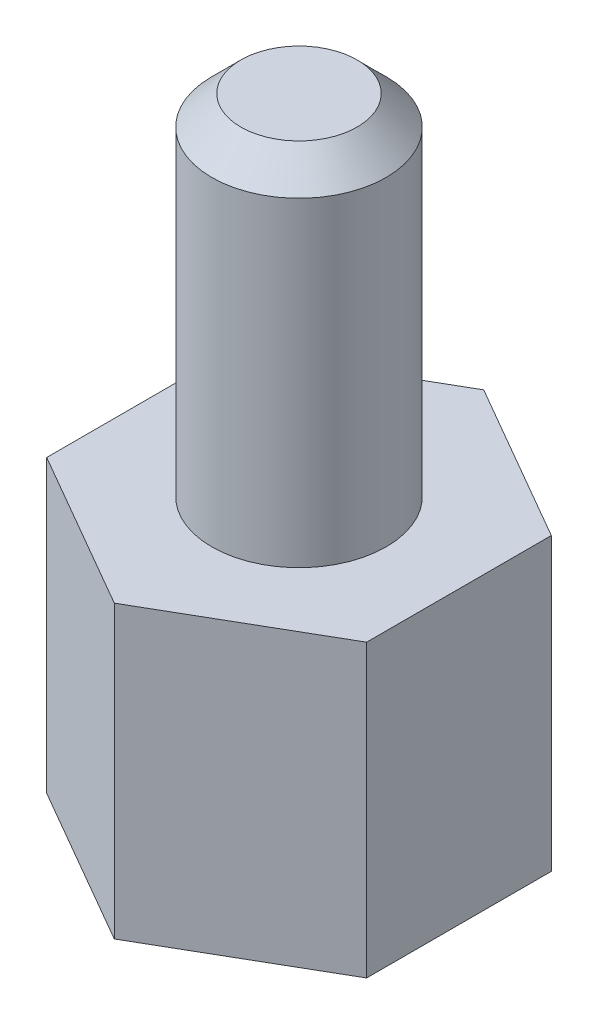
ISO-10303-21;
HEADER;
FILE_DESCRIPTION(('STEP AP214'),'2;1');
FILE_NAME('part.step','',(''),(''),'','','');
FILE_SCHEMA(('AUTOMOTIVE_DESIGN { 1 0 10303 214 1 1 1 1 }'));
ENDSEC;
DATA;
#1=APPLICATION_CONTEXT('core data for automotive mechanical design processes');
#2=APPLICATION_PROTOCOL_DEFINITION('international standard','automotive_design',2000,#1);
#3=PRODUCT_CONTEXT('',#1,'mechanical');
#4=PRODUCT('Part','Part','',(#3));
#5=PRODUCT_RELATED_PRODUCT_CATEGORY('part','',(#4));
#6=PRODUCT_DEFINITION_FORMATION('','',#4);
#7=PRODUCT_DEFINITION_CONTEXT('part definition',#1,'design');
#8=PRODUCT_DEFINITION('design','',#6,#7);
#9=PRODUCT_DEFINITION_SHAPE('','',#8);
#10=(LENGTH_UNIT() NAMED_UNIT(*) SI_UNIT(.MILLI.,.METRE.));
#11=(NAMED_UNIT(*) PLANE_ANGLE_UNIT() SI_UNIT($,.RADIAN.));
#12=(NAMED_UNIT(*) SI_UNIT($,.STERADIAN.) SOLID_ANGLE_UNIT());
#13=UNCERTAINTY_MEASURE_WITH_UNIT(LENGTH_MEASURE(1.E-05),#10,'distance_accuracy_value','');
#14=(GEOMETRIC_REPRESENTATION_CONTEXT(3) GLOBAL_UNCERTAINTY_ASSIGNED_CONTEXT((#13)) GLOBAL_UNIT_ASSIGNED_CONTEXT((#10,
#11,#12)) REPRESENTATION_CONTEXT('',''));
#15=CARTESIAN_POINT('',(0.,0.,0.));
#16=DIRECTION('',(0.,0.,1.));
#17=DIRECTION('',(1.,0.,0.));
#18=AXIS2_PLACEMENT_3D('',#15,#16,#17);
#19=CARTESIAN_POINT('',(0.,5.,0.));
#20=DIRECTION('',(0.,1.,0.));
#21=DIRECTION('',(0.,0.,1.00000000000001));
#22=AXIS2_PLACEMENT_3D('',#19,#20,#21);
#23=PLANE('',#22);
#24=DIRECTION('',(-0.866025403784444,0.,-0.500000000000004));
#25=VECTOR('',#24,1.);
#26=CARTESIAN_POINT('',(2.75,5.,-1.58771324027147));
#27=LINE('',#26,#25);
#28=CARTESIAN_POINT('',(2.75,5.,-1.58771324027147));
#29=VERTEX_POINT('',#28);
#30=CARTESIAN_POINT('',(0.,5.,-3.17542648054293));
#31=VERTEX_POINT('',#30);
#32=EDGE_CURVE('E139',#29,#31,#27,.T.);
#33=ORIENTED_EDGE('',*,*,#32,.T.);
#34=DIRECTION('',(-0.866025403784444,0.,0.500000000000003));
#35=VECTOR('',#34,1.);
#36=CARTESIAN_POINT('',(0.,5.,-3.17542648054293));
#37=LINE('',#36,#35);
#38=CARTESIAN_POINT('',(-2.75000000000001,5.,-1.58771324027145));
#39=VERTEX_POINT('',#38);
#40=EDGE_CURVE('E96',#31,#39,#37,.T.);
#41=ORIENTED_EDGE('',*,*,#40,.T.);
#42=DIRECTION('',(0.,0.,1.00000000000001));
#43=VECTOR('',#42,1.);
#44=CARTESIAN_POINT('',(-2.75000000000001,5.,-1.58771324027145));
#45=LINE('',#44,#43);
#46=CARTESIAN_POINT('',(-2.75,5.,1.58771324027149));
#47=VERTEX_POINT('',#46);
#48=EDGE_CURVE('E110',#39,#47,#45,.T.);
#49=ORIENTED_EDGE('',*,*,#48,.T.);
#50=DIRECTION('',(0.866025403784444,0.,0.500000000000004));
#51=VECTOR('',#50,1.);
#52=CARTESIAN_POINT('',(-2.75,5.,1.58771324027149));
#53=LINE('',#52,#51);
#54=CARTESIAN_POINT('',(0.,5.,3.17542648054295));
#55=VERTEX_POINT('',#54);
#56=EDGE_CURVE('E104',#47,#55,#53,.T.);
#57=ORIENTED_EDGE('',*,*,#56,.T.);
#58=DIRECTION('',(0.866025403784444,0.,-0.500000000000003));
#59=VECTOR('',#58,1.);
#60=CARTESIAN_POINT('',(0.,5.,3.17542648054295));
#61=LINE('',#60,#59);
#62=CARTESIAN_POINT('',(2.75000000000003,5.,1.58771324027149));
#63=VERTEX_POINT('',#62);
#64=EDGE_CURVE('E108',#55,#63,#61,.T.);
#65=ORIENTED_EDGE('',*,*,#64,.T.);
#66=DIRECTION('',(0.,0.,-1.00000000000001));
#67=VECTOR('',#66,1.);
#68=CARTESIAN_POINT('',(2.75000000000003,5.,1.58771324027149));
#69=LINE('',#68,#67);
#70=EDGE_CURVE('E57',#63,#29,#69,.T.);
#71=ORIENTED_EDGE('',*,*,#70,.T.);
#72=EDGE_LOOP('',(#33,#41,#49,#57,#65,#71));
#73=FACE_BOUND('',#72,.T.);
#74=CARTESIAN_POINT('',(0.,5.,0.));
#75=DIRECTION('',(0.,1.,0.));
#76=DIRECTION('',(0.,0.,1.00000000000001));
#77=AXIS2_PLACEMENT_3D('',#74,#75,#76);
#78=CIRCLE('',#77,1.5);
#79=CARTESIAN_POINT('',(0.,5.,1.50000000000001));
#80=VERTEX_POINT('',#79);
#81=EDGE_CURVE('E132',#80,#80,#78,.T.);
#82=ORIENTED_EDGE('',*,*,#81,.F.);
#83=EDGE_LOOP('',(#82));
#84=FACE_BOUND('',#83,.T.);
#85=ADVANCED_FACE('F40',(#73,#84),#23,.T.);
#86=CARTESIAN_POINT('',(2.75,5.,-1.58771324027147));
#87=DIRECTION('',(-0.500000000000004,0.,0.866025403784444));
#88=DIRECTION('',(0.866025403784444,0.,0.500000000000004));
#89=AXIS2_PLACEMENT_3D('',#86,#87,#88);
#90=PLANE('',#89);
#91=DIRECTION('',(-0.866025403784444,0.,-0.500000000000004));
#92=VECTOR('',#91,1.);
#93=CARTESIAN_POINT('',(2.75,0.,-1.58771324027147));
#94=LINE('',#93,#92);
#95=CARTESIAN_POINT('',(2.75,0.,-1.58771324027147));
#96=VERTEX_POINT('',#95);
#97=CARTESIAN_POINT('',(0.,0.,-3.17542648054293));
#98=VERTEX_POINT('',#97);
#99=EDGE_CURVE('E128',#96,#98,#94,.T.);
#100=ORIENTED_EDGE('',*,*,#99,.T.);
#101=DIRECTION('',(0.,-1.,0.));
#102=VECTOR('',#101,1.);
#103=CARTESIAN_POINT('',(0.,5.,-3.17542648054293));
#104=LINE('',#103,#102);
#105=EDGE_CURVE('E146',#31,#98,#104,.T.);
#106=ORIENTED_EDGE('',*,*,#105,.F.);
#107=ORIENTED_EDGE('',*,*,#32,.F.);
#108=DIRECTION('',(0.,-1.,0.));
#109=VECTOR('',#108,1.);
#110=CARTESIAN_POINT('',(2.75,5.,-1.58771324027147));
#111=LINE('',#110,#109);
#112=EDGE_CURVE('E124',#29,#96,#111,.T.);
#113=ORIENTED_EDGE('',*,*,#112,.T.);
#114=EDGE_LOOP('',(#100,#106,#107,#113));
#115=FACE_BOUND('',#114,.T.);
#116=ADVANCED_FACE('F166',(#115),#90,.F.);
#117=CARTESIAN_POINT('',(0.,5.,-3.17542648054293));
#118=DIRECTION('',(0.500000000000003,0.,0.866025403784444));
#119=DIRECTION('',(0.866025403784444,0.,-0.500000000000003));
#120=AXIS2_PLACEMENT_3D('',#117,#118,#119);
#121=PLANE('',#120);
#122=DIRECTION('',(-0.866025403784444,0.,0.500000000000003));
#123=VECTOR('',#122,1.);
#124=CARTESIAN_POINT('',(0.,0.,-3.17542648054293));
#125=LINE('',#124,#123);
#126=CARTESIAN_POINT('',(-2.75000000000001,0.,-1.58771324027145));
#127=VERTEX_POINT('',#126);
#128=EDGE_CURVE('E131',#98,#127,#125,.T.);
#129=ORIENTED_EDGE('',*,*,#128,.T.);
#130=DIRECTION('',(0.,-1.,0.));
#131=VECTOR('',#130,1.);
#132=CARTESIAN_POINT('',(-2.75000000000001,5.,-1.58771324027145));
#133=LINE('',#132,#131);
#134=EDGE_CURVE('E143',#39,#127,#133,.T.);
#135=ORIENTED_EDGE('',*,*,#134,.F.);
#136=ORIENTED_EDGE('',*,*,#40,.F.);
#137=ORIENTED_EDGE('',*,*,#105,.T.);
#138=EDGE_LOOP('',(#129,#135,#136,#137));
#139=FACE_BOUND('',#138,.T.);
#140=ADVANCED_FACE('F171',(#139),#121,.F.);
#141=CARTESIAN_POINT('',(-2.75000000000001,5.,-1.58771324027145));
#142=DIRECTION('',(1.00000000000001,0.,0.));
#143=DIRECTION('',(0.,0.,-1.00000000000001));
#144=AXIS2_PLACEMENT_3D('',#141,#142,#143);
#145=PLANE('',#144);
#146=DIRECTION('',(0.,0.,1.00000000000001));
#147=VECTOR('',#146,1.);
#148=CARTESIAN_POINT('',(-2.75000000000001,0.,-1.58771324027145));
#149=LINE('',#148,#147);
#150=CARTESIAN_POINT('',(-2.75,0.,1.58771324027149));
#151=VERTEX_POINT('',#150);
#152=EDGE_CURVE('E134',#127,#151,#149,.T.);
#153=ORIENTED_EDGE('',*,*,#152,.T.);
#154=DIRECTION('',(0.,-1.,0.));
#155=VECTOR('',#154,1.);
#156=CARTESIAN_POINT('',(-2.75,5.,1.58771324027149));
#157=LINE('',#156,#155);
#158=EDGE_CURVE('E119',#47,#151,#157,.T.);
#159=ORIENTED_EDGE('',*,*,#158,.F.);
#160=ORIENTED_EDGE('',*,*,#48,.F.);
#161=ORIENTED_EDGE('',*,*,#134,.T.);
#162=EDGE_LOOP('',(#153,#159,#160,#161));
#163=FACE_BOUND('',#162,.T.);
#164=ADVANCED_FACE('F186',(#163),#145,.F.);
#165=CARTESIAN_POINT('',(-2.75,5.,1.58771324027149));
#166=DIRECTION('',(0.500000000000003,0.,-0.866025403784444));
#167=DIRECTION('',(-0.866025403784444,0.,-0.500000000000003));
#168=AXIS2_PLACEMENT_3D('',#165,#166,#167);
#169=PLANE('',#168);
#170=DIRECTION('',(0.866025403784444,0.,0.500000000000004));
#171=VECTOR('',#170,1.);
#172=CARTESIAN_POINT('',(-2.75,0.,1.58771324027149));
#173=LINE('',#172,#171);
#174=CARTESIAN_POINT('',(0.,0.,3.17542648054295));
#175=VERTEX_POINT('',#174);
#176=EDGE_CURVE('E118',#151,#175,#173,.T.);
#177=ORIENTED_EDGE('',*,*,#176,.T.);
#178=DIRECTION('',(0.,-1.,0.));
#179=VECTOR('',#178,1.);
#180=CARTESIAN_POINT('',(0.,5.,3.17542648054295));
#181=LINE('',#180,#179);
#182=EDGE_CURVE('E115',#55,#175,#181,.T.);
#183=ORIENTED_EDGE('',*,*,#182,.F.);
#184=ORIENTED_EDGE('',*,*,#56,.F.);
#185=ORIENTED_EDGE('',*,*,#158,.T.);
#186=EDGE_LOOP('',(#177,#183,#184,#185));
#187=FACE_BOUND('',#186,.T.);
#188=ADVANCED_FACE('F116',(#187),#169,.F.);
#189=CARTESIAN_POINT('',(0.,5.,3.17542648054295));
#190=DIRECTION('',(-0.500000000000003,0.,-0.866025403784444));
#191=DIRECTION('',(-0.866025403784444,0.,0.500000000000003));
#192=AXIS2_PLACEMENT_3D('',#189,#190,#191);
#193=PLANE('',#192);
#194=DIRECTION('',(0.866025403784444,0.,-0.500000000000003));
#195=VECTOR('',#194,1.);
#196=CARTESIAN_POINT('',(0.,0.,3.17542648054295));
#197=LINE('',#196,#195);
#198=CARTESIAN_POINT('',(2.75000000000003,0.,1.58771324027149));
#199=VERTEX_POINT('',#198);
#200=EDGE_CURVE('E81',#175,#199,#197,.T.);
#201=ORIENTED_EDGE('',*,*,#200,.T.);
#202=DIRECTION('',(0.,-1.,0.));
#203=VECTOR('',#202,1.);
#204=CARTESIAN_POINT('',(2.75000000000003,5.,1.58771324027149));
#205=LINE('',#204,#203);
#206=EDGE_CURVE('E120',#63,#199,#205,.T.);
#207=ORIENTED_EDGE('',*,*,#206,.F.);
#208=ORIENTED_EDGE('',*,*,#64,.F.);
#209=ORIENTED_EDGE('',*,*,#182,.T.);
#210=EDGE_LOOP('',(#201,#207,#208,#209));
#211=FACE_BOUND('',#210,.T.);
#212=ADVANCED_FACE('F122',(#211),#193,.F.);
#213=CARTESIAN_POINT('',(2.75000000000003,5.,1.58771324027149));
#214=DIRECTION('',(-1.00000000000001,0.,0.));
#215=DIRECTION('',(0.,0.,1.00000000000001));
#216=AXIS2_PLACEMENT_3D('',#213,#214,#215);
#217=PLANE('',#216);
#218=DIRECTION('',(0.,0.,-1.00000000000001));
#219=VECTOR('',#218,1.);
#220=CARTESIAN_POINT('',(2.75000000000003,0.,1.58771324027149));
#221=LINE('',#220,#219);
#222=EDGE_CURVE('E87',#199,#96,#221,.T.);
#223=ORIENTED_EDGE('',*,*,#222,.T.);
#224=ORIENTED_EDGE('',*,*,#112,.F.);
#225=ORIENTED_EDGE('',*,*,#70,.F.);
#226=ORIENTED_EDGE('',*,*,#206,.T.);
#227=EDGE_LOOP('',(#223,#224,#225,#226));
#228=FACE_BOUND('',#227,.T.);
#229=ADVANCED_FACE('F178',(#228),#217,.F.);
#230=CARTESIAN_POINT('',(0.,0.,0.));
#231=DIRECTION('',(0.,1.,0.));
#232=DIRECTION('',(0.,0.,1.00000000000001));
#233=AXIS2_PLACEMENT_3D('',#230,#231,#232);
#234=PLANE('',#233);
#235=CARTESIAN_POINT('',(0.,0.,0.));
#236=DIRECTION('',(0.,-1.,0.));
#237=DIRECTION('',(0.,0.,-1.00000000000001));
#238=AXIS2_PLACEMENT_3D('',#235,#236,#237);
#239=CIRCLE('',#238,1.24999999999999);
#240=CARTESIAN_POINT('',(0.,0.,-1.25));
#241=VERTEX_POINT('',#240);
#242=EDGE_CURVE('E206',#241,#241,#239,.T.);
#243=ORIENTED_EDGE('',*,*,#242,.F.);
#244=EDGE_LOOP('',(#243));
#245=FACE_BOUND('',#244,.T.);
#246=ORIENTED_EDGE('',*,*,#99,.F.);
#247=ORIENTED_EDGE('',*,*,#222,.F.);
#248=ORIENTED_EDGE('',*,*,#200,.F.);
#249=ORIENTED_EDGE('',*,*,#176,.F.);
#250=ORIENTED_EDGE('',*,*,#152,.F.);
#251=ORIENTED_EDGE('',*,*,#128,.F.);
#252=EDGE_LOOP('',(#246,#247,#248,#249,#250,#251));
#253=FACE_BOUND('',#252,.T.);
#254=ADVANCED_FACE('F175',(#245,#253),#234,.F.);
#255=CARTESIAN_POINT('',(0.,11.,0.));
#256=DIRECTION('',(0.,-1.,0.));
#257=DIRECTION('',(0.,0.,-1.00000000000001));
#258=AXIS2_PLACEMENT_3D('',#255,#256,#257);
#259=CYLINDRICAL_SURFACE('',#258,1.5);
#260=CARTESIAN_POINT('',(0.,10.5,0.));
#261=DIRECTION('',(0.,1.,0.));
#262=DIRECTION('',(0.,0.,1.00000000000001));
#263=AXIS2_PLACEMENT_3D('',#260,#261,#262);
#264=CIRCLE('',#263,1.5);
#265=CARTESIAN_POINT('',(0.,10.5,1.50000000000001));
#266=VERTEX_POINT('',#265);
#267=EDGE_CURVE('E11',#266,#266,#264,.F.);
#268=ORIENTED_EDGE('',*,*,#267,.T.);
#269=EDGE_LOOP('',(#268));
#270=FACE_BOUND('',#269,.T.);
#271=ORIENTED_EDGE('',*,*,#81,.T.);
#272=EDGE_LOOP('',(#271));
#273=FACE_BOUND('',#272,.T.);
#274=ADVANCED_FACE('F162',(#270,#273),#259,.T.);
#275=CARTESIAN_POINT('',(0.,11.,0.));
#276=DIRECTION('',(0.,1.,0.));
#277=DIRECTION('',(0.,0.,1.00000000000001));
#278=AXIS2_PLACEMENT_3D('',#275,#276,#277);
#279=PLANE('',#278);
#280=CARTESIAN_POINT('',(0.,11.,0.));
#281=DIRECTION('',(0.,1.,0.));
#282=DIRECTION('',(0.,0.,1.00000000000001));
#283=AXIS2_PLACEMENT_3D('',#280,#281,#282);
#284=CIRCLE('',#283,1.);
#285=CARTESIAN_POINT('',(0.,11.,1.00000000000001));
#286=VERTEX_POINT('',#285);
#287=EDGE_CURVE('E49',#286,#286,#284,.T.);
#288=ORIENTED_EDGE('',*,*,#287,.T.);
#289=EDGE_LOOP('',(#288));
#290=FACE_BOUND('',#289,.T.);
#291=ADVANCED_FACE('F150',(#290),#279,.T.);
#292=CARTESIAN_POINT('',(0.,11.,0.));
#293=DIRECTION('',(0.,-1.,0.));
#294=DIRECTION('',(0.,0.,-1.00000000000001));
#295=AXIS2_PLACEMENT_3D('',#292,#293,#294);
#296=CONICAL_SURFACE('',#295,1.,0.785398163397447);
#297=ORIENTED_EDGE('',*,*,#267,.F.);
#298=EDGE_LOOP('',(#297));
#299=FACE_BOUND('',#298,.T.);
#300=ORIENTED_EDGE('',*,*,#287,.F.);
#301=EDGE_LOOP('',(#300));
#302=FACE_BOUND('',#301,.T.);
#303=ADVANCED_FACE('F42',(#299,#302),#296,.T.);
#304=CARTESIAN_POINT('',(0.,8.50000000000001,0.));
#305=DIRECTION('',(0.,-1.,0.));
#306=DIRECTION('',(0.,0.,-1.00000000000001));
#307=AXIS2_PLACEMENT_3D('',#304,#305,#306);
#308=CONICAL_SURFACE('',#307,1.24999999999999,1.02974425867665);
#309=CARTESIAN_POINT('',(0.,9.25107577378445,0.));
#310=VERTEX_POINT('',#309);
#311=VERTEX_LOOP('',#310);
#312=FACE_BOUND('',#311,.T.);
#313=CARTESIAN_POINT('',(0.,8.50000000000001,0.));
#314=DIRECTION('',(0.,-1.,0.));
#315=DIRECTION('',(0.,0.,-1.00000000000001));
#316=AXIS2_PLACEMENT_3D('',#313,#314,#315);
#317=CIRCLE('',#316,1.24999999999999);
#318=CARTESIAN_POINT('',(0.,8.50000000000001,-1.25));
#319=VERTEX_POINT('',#318);
#320=EDGE_CURVE('E203',#319,#319,#317,.T.);
#321=ORIENTED_EDGE('',*,*,#320,.T.);
#322=EDGE_LOOP('',(#321));
#323=FACE_BOUND('',#322,.T.);
#324=ADVANCED_FACE('F153',(#312,#323),#308,.F.);
#325=CARTESIAN_POINT('',(0.,0.,0.));
#326=DIRECTION('',(0.,-1.,0.));
#327=DIRECTION('',(0.,0.,-1.00000000000001));
#328=AXIS2_PLACEMENT_3D('',#325,#326,#327);
#329=CYLINDRICAL_SURFACE('',#328,1.24999999999999);
#330=ORIENTED_EDGE('',*,*,#320,.F.);
#331=EDGE_LOOP('',(#330));
#332=FACE_BOUND('',#331,.T.);
#333=ORIENTED_EDGE('',*,*,#242,.T.);
#334=EDGE_LOOP('',(#333));
#335=FACE_BOUND('',#334,.T.);
#336=ADVANCED_FACE('F159',(#332,#335),#329,.F.);
#337=CLOSED_SHELL('',(#85,#116,#140,#164,#188,#212,#229,#254,#274,#291,#303,#324,#336));
#338=MANIFOLD_SOLID_BREP('B2',#337);
#339=ADVANCED_BREP_SHAPE_REPRESENTATION('',(#18,#338),#14);
#340=SHAPE_DEFINITION_REPRESENTATION(#9,#339);
ENDSEC;
END-ISO-10303-21;
